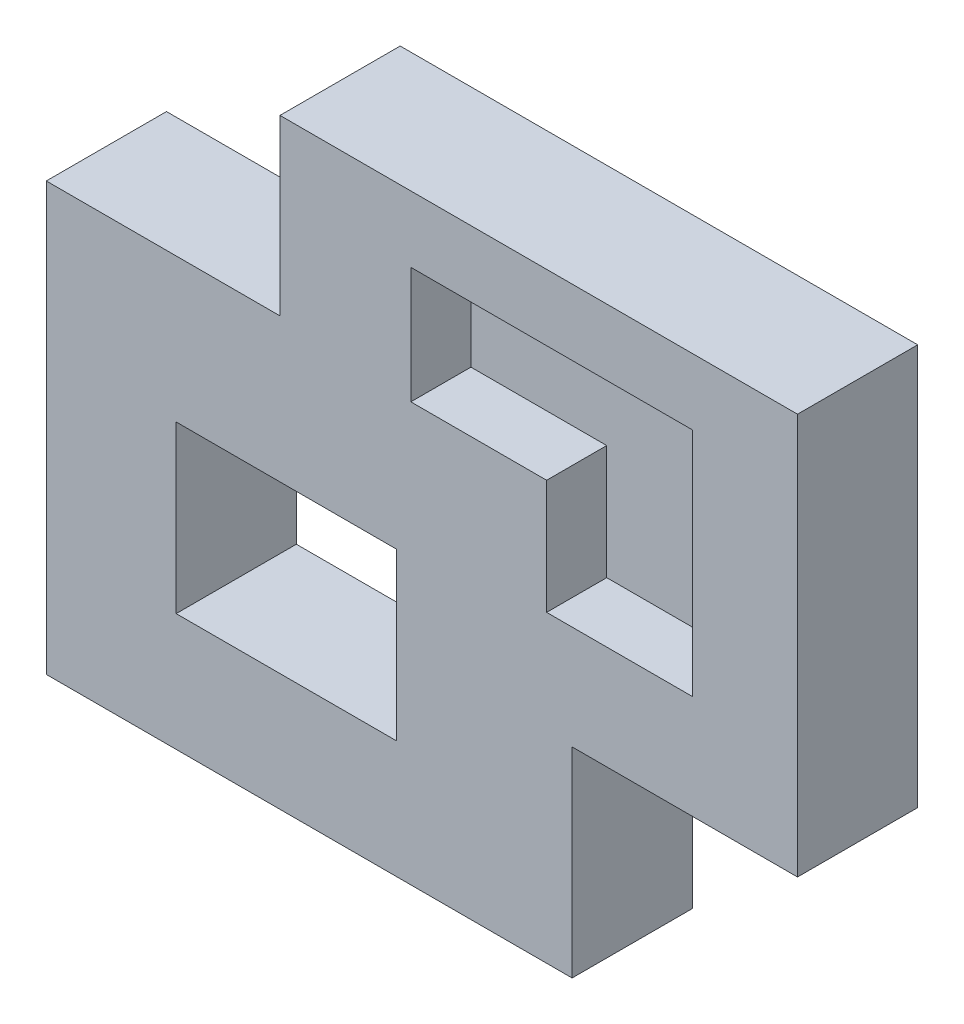
ISO-10303-21;
HEADER;
FILE_DESCRIPTION(('STEP AP214'),'2;1');
FILE_NAME('part.step','',(''),(''),'','','');
FILE_SCHEMA(('AUTOMOTIVE_DESIGN { 1 0 10303 214 1 1 1 1 }'));
ENDSEC;
DATA;
#1=APPLICATION_CONTEXT('core data for automotive mechanical design processes');
#2=APPLICATION_PROTOCOL_DEFINITION('international standard','automotive_design',2000,#1);
#3=PRODUCT_CONTEXT('',#1,'mechanical');
#4=PRODUCT('Part','Part','',(#3));
#5=PRODUCT_RELATED_PRODUCT_CATEGORY('part','',(#4));
#6=PRODUCT_DEFINITION_FORMATION('','',#4);
#7=PRODUCT_DEFINITION_CONTEXT('part definition',#1,'design');
#8=PRODUCT_DEFINITION('design','',#6,#7);
#9=PRODUCT_DEFINITION_SHAPE('','',#8);
#10=(LENGTH_UNIT() NAMED_UNIT(*) SI_UNIT(.MILLI.,.METRE.));
#11=(NAMED_UNIT(*) PLANE_ANGLE_UNIT() SI_UNIT($,.RADIAN.));
#12=(NAMED_UNIT(*) SI_UNIT($,.STERADIAN.) SOLID_ANGLE_UNIT());
#13=UNCERTAINTY_MEASURE_WITH_UNIT(LENGTH_MEASURE(1.E-05),#10,'distance_accuracy_value','');
#14=(GEOMETRIC_REPRESENTATION_CONTEXT(3) GLOBAL_UNCERTAINTY_ASSIGNED_CONTEXT((#13)) GLOBAL_UNIT_ASSIGNED_CONTEXT((#10,
#11,#12)) REPRESENTATION_CONTEXT('',''));
#15=CARTESIAN_POINT('',(0.,0.,0.));
#16=DIRECTION('',(0.,0.,1.));
#17=DIRECTION('',(1.,0.,0.));
#18=AXIS2_PLACEMENT_3D('',#15,#16,#17);
#19=CARTESIAN_POINT('',(0.,0.,20.));
#20=DIRECTION('',(1.,0.,0.));
#21=DIRECTION('',(0.,0.,-1.));
#22=AXIS2_PLACEMENT_3D('',#19,#20,#21);
#23=PLANE('',#22);
#24=DIRECTION('',(0.,-1.,0.));
#25=VECTOR('',#24,1.);
#26=CARTESIAN_POINT('',(0.,0.,0.));
#27=LINE('',#26,#25);
#28=CARTESIAN_POINT('',(0.,71.1101804123711,0.));
#29=VERTEX_POINT('',#28);
#30=CARTESIAN_POINT('',(0.,0.,0.));
#31=VERTEX_POINT('',#30);
#32=EDGE_CURVE('E249',#29,#31,#27,.T.);
#33=ORIENTED_EDGE('',*,*,#32,.T.);
#34=DIRECTION('',(0.,0.,-1.));
#35=VECTOR('',#34,1.);
#36=CARTESIAN_POINT('',(0.,0.,20.));
#37=LINE('',#36,#35);
#38=CARTESIAN_POINT('',(0.,0.,20.));
#39=VERTEX_POINT('',#38);
#40=EDGE_CURVE('E11',#39,#31,#37,.T.);
#41=ORIENTED_EDGE('',*,*,#40,.F.);
#42=DIRECTION('',(0.,-1.,0.));
#43=VECTOR('',#42,1.);
#44=CARTESIAN_POINT('',(0.,0.,20.));
#45=LINE('',#44,#43);
#46=CARTESIAN_POINT('',(0.,71.1101804123711,20.));
#47=VERTEX_POINT('',#46);
#48=EDGE_CURVE('E271',#47,#39,#45,.T.);
#49=ORIENTED_EDGE('',*,*,#48,.F.);
#50=DIRECTION('',(0.,0.,-1.));
#51=VECTOR('',#50,1.);
#52=CARTESIAN_POINT('',(0.,71.1101804123711,20.));
#53=LINE('',#52,#51);
#54=EDGE_CURVE('E288',#47,#29,#53,.T.);
#55=ORIENTED_EDGE('',*,*,#54,.T.);
#56=EDGE_LOOP('',(#33,#41,#49,#55));
#57=FACE_BOUND('',#56,.T.);
#58=ADVANCED_FACE('F42',(#57),#23,.F.);
#59=CARTESIAN_POINT('',(0.,0.,20.));
#60=DIRECTION('',(0.,1.,0.));
#61=DIRECTION('',(0.,0.,1.));
#62=AXIS2_PLACEMENT_3D('',#59,#60,#61);
#63=PLANE('',#62);
#64=DIRECTION('',(1.,0.,0.));
#65=VECTOR('',#64,1.);
#66=CARTESIAN_POINT('',(0.,0.,0.));
#67=LINE('',#66,#65);
#68=CARTESIAN_POINT('',(87.4925257731959,0.,0.));
#69=VERTEX_POINT('',#68);
#70=EDGE_CURVE('E257',#31,#69,#67,.T.);
#71=ORIENTED_EDGE('',*,*,#70,.T.);
#72=DIRECTION('',(0.,0.,-1.));
#73=VECTOR('',#72,1.);
#74=CARTESIAN_POINT('',(87.4925257731959,0.,20.));
#75=LINE('',#74,#73);
#76=CARTESIAN_POINT('',(87.4925257731959,0.,20.));
#77=VERTEX_POINT('',#76);
#78=EDGE_CURVE('E49',#77,#69,#75,.T.);
#79=ORIENTED_EDGE('',*,*,#78,.F.);
#80=DIRECTION('',(1.,0.,0.));
#81=VECTOR('',#80,1.);
#82=CARTESIAN_POINT('',(0.,0.,20.));
#83=LINE('',#82,#81);
#84=EDGE_CURVE('E274',#39,#77,#83,.T.);
#85=ORIENTED_EDGE('',*,*,#84,.F.);
#86=ORIENTED_EDGE('',*,*,#40,.T.);
#87=EDGE_LOOP('',(#71,#79,#85,#86));
#88=FACE_BOUND('',#87,.T.);
#89=ADVANCED_FACE('F332',(#88),#63,.F.);
#90=CARTESIAN_POINT('',(87.4925257731959,0.,20.));
#91=DIRECTION('',(-1.,0.,0.));
#92=DIRECTION('',(0.,0.,1.));
#93=AXIS2_PLACEMENT_3D('',#90,#91,#92);
#94=PLANE('',#93);
#95=DIRECTION('',(0.,1.,0.));
#96=VECTOR('',#95,1.);
#97=CARTESIAN_POINT('',(87.4925257731959,0.,0.));
#98=LINE('',#97,#96);
#99=CARTESIAN_POINT('',(87.4925257731959,33.3047680412371,0.));
#100=VERTEX_POINT('',#99);
#101=EDGE_CURVE('E259',#69,#100,#98,.T.);
#102=ORIENTED_EDGE('',*,*,#101,.T.);
#103=DIRECTION('',(0.,0.,-1.));
#104=VECTOR('',#103,1.);
#105=CARTESIAN_POINT('',(87.4925257731959,33.3047680412371,20.));
#106=LINE('',#105,#104);
#107=CARTESIAN_POINT('',(87.4925257731959,33.3047680412371,20.));
#108=VERTEX_POINT('',#107);
#109=EDGE_CURVE('E303',#108,#100,#106,.T.);
#110=ORIENTED_EDGE('',*,*,#109,.F.);
#111=DIRECTION('',(0.,1.,0.));
#112=VECTOR('',#111,1.);
#113=CARTESIAN_POINT('',(87.4925257731959,0.,20.));
#114=LINE('',#113,#112);
#115=EDGE_CURVE('E276',#77,#108,#114,.T.);
#116=ORIENTED_EDGE('',*,*,#115,.F.);
#117=ORIENTED_EDGE('',*,*,#78,.T.);
#118=EDGE_LOOP('',(#102,#110,#116,#117));
#119=FACE_BOUND('',#118,.T.);
#120=ADVANCED_FACE('F310',(#119),#94,.F.);
#121=CARTESIAN_POINT('',(125.,33.3047680412371,20.));
#122=DIRECTION('',(0.,1.,0.));
#123=DIRECTION('',(0.,0.,1.));
#124=AXIS2_PLACEMENT_3D('',#121,#122,#123);
#125=PLANE('',#124);
#126=DIRECTION('',(1.,0.,0.));
#127=VECTOR('',#126,1.);
#128=CARTESIAN_POINT('',(125.,33.3047680412371,0.));
#129=LINE('',#128,#127);
#130=CARTESIAN_POINT('',(125.,33.3047680412371,0.));
#131=VERTEX_POINT('',#130);
#132=EDGE_CURVE('E261',#100,#131,#129,.T.);
#133=ORIENTED_EDGE('',*,*,#132,.T.);
#134=DIRECTION('',(0.,0.,-1.));
#135=VECTOR('',#134,1.);
#136=CARTESIAN_POINT('',(125.,33.3047680412371,20.));
#137=LINE('',#136,#135);
#138=CARTESIAN_POINT('',(125.,33.3047680412371,20.));
#139=VERTEX_POINT('',#138);
#140=EDGE_CURVE('E300',#139,#131,#137,.T.);
#141=ORIENTED_EDGE('',*,*,#140,.F.);
#142=DIRECTION('',(1.,0.,0.));
#143=VECTOR('',#142,1.);
#144=CARTESIAN_POINT('',(125.,33.3047680412371,20.));
#145=LINE('',#144,#143);
#146=EDGE_CURVE('E278',#108,#139,#145,.T.);
#147=ORIENTED_EDGE('',*,*,#146,.F.);
#148=ORIENTED_EDGE('',*,*,#109,.T.);
#149=EDGE_LOOP('',(#133,#141,#147,#148));
#150=FACE_BOUND('',#149,.T.);
#151=ADVANCED_FACE('F321',(#150),#125,.F.);
#152=CARTESIAN_POINT('',(125.,33.3047680412371,20.));
#153=DIRECTION('',(-1.,0.,0.));
#154=DIRECTION('',(0.,0.,1.));
#155=AXIS2_PLACEMENT_3D('',#152,#153,#154);
#156=PLANE('',#155);
#157=DIRECTION('',(0.,1.,0.));
#158=VECTOR('',#157,1.);
#159=CARTESIAN_POINT('',(125.,33.3047680412371,0.));
#160=LINE('',#159,#158);
#161=CARTESIAN_POINT('',(125.,100.,0.));
#162=VERTEX_POINT('',#161);
#163=EDGE_CURVE('E263',#131,#162,#160,.T.);
#164=ORIENTED_EDGE('',*,*,#163,.T.);
#165=DIRECTION('',(0.,0.,-1.));
#166=VECTOR('',#165,1.);
#167=CARTESIAN_POINT('',(125.,100.,20.));
#168=LINE('',#167,#166);
#169=CARTESIAN_POINT('',(125.,100.,20.));
#170=VERTEX_POINT('',#169);
#171=EDGE_CURVE('E297',#170,#162,#168,.T.);
#172=ORIENTED_EDGE('',*,*,#171,.F.);
#173=DIRECTION('',(0.,1.,0.));
#174=VECTOR('',#173,1.);
#175=CARTESIAN_POINT('',(125.,33.3047680412371,20.));
#176=LINE('',#175,#174);
#177=EDGE_CURVE('E280',#139,#170,#176,.T.);
#178=ORIENTED_EDGE('',*,*,#177,.F.);
#179=ORIENTED_EDGE('',*,*,#140,.T.);
#180=EDGE_LOOP('',(#164,#172,#178,#179));
#181=FACE_BOUND('',#180,.T.);
#182=ADVANCED_FACE('F325',(#181),#156,.F.);
#183=CARTESIAN_POINT('',(38.8855670103093,100.,20.));
#184=DIRECTION('',(0.,-1.,0.));
#185=DIRECTION('',(0.,0.,-1.));
#186=AXIS2_PLACEMENT_3D('',#183,#184,#185);
#187=PLANE('',#186);
#188=DIRECTION('',(-1.,0.,0.));
#189=VECTOR('',#188,1.);
#190=CARTESIAN_POINT('',(38.8855670103093,100.,0.));
#191=LINE('',#190,#189);
#192=CARTESIAN_POINT('',(38.8855670103093,100.,0.));
#193=VERTEX_POINT('',#192);
#194=EDGE_CURVE('E265',#162,#193,#191,.T.);
#195=ORIENTED_EDGE('',*,*,#194,.T.);
#196=DIRECTION('',(0.,0.,-1.));
#197=VECTOR('',#196,1.);
#198=CARTESIAN_POINT('',(38.8855670103093,100.,20.));
#199=LINE('',#198,#197);
#200=CARTESIAN_POINT('',(38.8855670103093,100.,20.));
#201=VERTEX_POINT('',#200);
#202=EDGE_CURVE('E294',#201,#193,#199,.T.);
#203=ORIENTED_EDGE('',*,*,#202,.F.);
#204=DIRECTION('',(-1.,0.,0.));
#205=VECTOR('',#204,1.);
#206=CARTESIAN_POINT('',(38.8855670103093,100.,20.));
#207=LINE('',#206,#205);
#208=EDGE_CURVE('E282',#170,#201,#207,.T.);
#209=ORIENTED_EDGE('',*,*,#208,.F.);
#210=ORIENTED_EDGE('',*,*,#171,.T.);
#211=EDGE_LOOP('',(#195,#203,#209,#210));
#212=FACE_BOUND('',#211,.T.);
#213=ADVANCED_FACE('F345',(#212),#187,.F.);
#214=CARTESIAN_POINT('',(38.8855670103093,100.,20.));
#215=DIRECTION('',(1.,0.,0.));
#216=DIRECTION('',(0.,0.,-1.));
#217=AXIS2_PLACEMENT_3D('',#214,#215,#216);
#218=PLANE('',#217);
#219=DIRECTION('',(0.,-1.,0.));
#220=VECTOR('',#219,1.);
#221=CARTESIAN_POINT('',(38.8855670103093,100.,0.));
#222=LINE('',#221,#220);
#223=CARTESIAN_POINT('',(38.8855670103093,71.1101804123711,0.));
#224=VERTEX_POINT('',#223);
#225=EDGE_CURVE('E267',#193,#224,#222,.T.);
#226=ORIENTED_EDGE('',*,*,#225,.T.);
#227=DIRECTION('',(0.,0.,-1.));
#228=VECTOR('',#227,1.);
#229=CARTESIAN_POINT('',(38.8855670103093,71.1101804123711,20.));
#230=LINE('',#229,#228);
#231=CARTESIAN_POINT('',(38.8855670103093,71.1101804123711,20.));
#232=VERTEX_POINT('',#231);
#233=EDGE_CURVE('E291',#232,#224,#230,.T.);
#234=ORIENTED_EDGE('',*,*,#233,.F.);
#235=DIRECTION('',(0.,-1.,0.));
#236=VECTOR('',#235,1.);
#237=CARTESIAN_POINT('',(38.8855670103093,100.,20.));
#238=LINE('',#237,#236);
#239=EDGE_CURVE('E284',#201,#232,#238,.T.);
#240=ORIENTED_EDGE('',*,*,#239,.F.);
#241=ORIENTED_EDGE('',*,*,#202,.T.);
#242=EDGE_LOOP('',(#226,#234,#240,#241));
#243=FACE_BOUND('',#242,.T.);
#244=ADVANCED_FACE('F343',(#243),#218,.F.);
#245=CARTESIAN_POINT('',(0.,71.1101804123711,20.));
#246=DIRECTION('',(0.,-1.,0.));
#247=DIRECTION('',(0.,0.,-1.));
#248=AXIS2_PLACEMENT_3D('',#245,#246,#247);
#249=PLANE('',#248);
#250=DIRECTION('',(-1.,0.,0.));
#251=VECTOR('',#250,1.);
#252=CARTESIAN_POINT('',(0.,71.1101804123711,0.));
#253=LINE('',#252,#251);
#254=EDGE_CURVE('E269',#224,#29,#253,.T.);
#255=ORIENTED_EDGE('',*,*,#254,.T.);
#256=ORIENTED_EDGE('',*,*,#54,.F.);
#257=DIRECTION('',(-1.,0.,0.));
#258=VECTOR('',#257,1.);
#259=CARTESIAN_POINT('',(0.,71.1101804123711,20.));
#260=LINE('',#259,#258);
#261=EDGE_CURVE('E286',#232,#47,#260,.T.);
#262=ORIENTED_EDGE('',*,*,#261,.F.);
#263=ORIENTED_EDGE('',*,*,#233,.T.);
#264=EDGE_LOOP('',(#255,#256,#262,#263));
#265=FACE_BOUND('',#264,.T.);
#266=ADVANCED_FACE('F338',(#265),#249,.F.);
#267=CARTESIAN_POINT('',(0.,71.1101804123711,20.));
#268=DIRECTION('',(0.,0.,-1.));
#269=DIRECTION('',(-1.,0.,0.));
#270=AXIS2_PLACEMENT_3D('',#267,#268,#269);
#271=PLANE('',#270);
#272=DIRECTION('',(1.,0.,0.));
#273=VECTOR('',#272,1.);
#274=CARTESIAN_POINT('',(83.2532134965902,69.6086472129878,20.));
#275=LINE('',#274,#273);
#276=CARTESIAN_POINT('',(60.6589668851143,69.6086472129878,20.));
#277=VERTEX_POINT('',#276);
#278=CARTESIAN_POINT('',(83.2532134965902,69.6086472129878,20.));
#279=VERTEX_POINT('',#278);
#280=EDGE_CURVE('E181',#277,#279,#275,.T.);
#281=ORIENTED_EDGE('',*,*,#280,.F.);
#282=DIRECTION('',(0.,-1.,0.));
#283=VECTOR('',#282,1.);
#284=CARTESIAN_POINT('',(60.6589668851143,69.6086472129878,20.));
#285=LINE('',#284,#283);
#286=CARTESIAN_POINT('',(60.6589668851143,88.9952859072309,20.));
#287=VERTEX_POINT('',#286);
#288=EDGE_CURVE('E56',#287,#277,#285,.T.);
#289=ORIENTED_EDGE('',*,*,#288,.F.);
#290=DIRECTION('',(-1.,0.,0.));
#291=VECTOR('',#290,1.);
#292=CARTESIAN_POINT('',(60.6589668851143,88.9952859072309,20.));
#293=LINE('',#292,#291);
#294=CARTESIAN_POINT('',(107.488557573703,88.9952859072309,20.));
#295=VERTEX_POINT('',#294);
#296=EDGE_CURVE('E198',#295,#287,#293,.T.);
#297=ORIENTED_EDGE('',*,*,#296,.F.);
#298=DIRECTION('',(0.,1.,0.));
#299=VECTOR('',#298,1.);
#300=CARTESIAN_POINT('',(107.488557573703,88.9952859072309,20.));
#301=LINE('',#300,#299);
#302=CARTESIAN_POINT('',(107.488557573703,50.5688125000461,20.));
#303=VERTEX_POINT('',#302);
#304=EDGE_CURVE('E192',#303,#295,#301,.T.);
#305=ORIENTED_EDGE('',*,*,#304,.F.);
#306=DIRECTION('',(1.,0.,0.));
#307=VECTOR('',#306,1.);
#308=CARTESIAN_POINT('',(107.488557573703,50.5688125000461,20.));
#309=LINE('',#308,#307);
#310=CARTESIAN_POINT('',(83.2532134965902,50.5688125000461,20.));
#311=VERTEX_POINT('',#310);
#312=EDGE_CURVE('E190',#311,#303,#309,.T.);
#313=ORIENTED_EDGE('',*,*,#312,.F.);
#314=DIRECTION('',(0.,-1.,0.));
#315=VECTOR('',#314,1.);
#316=CARTESIAN_POINT('',(83.2532134965902,50.5688125000461,20.));
#317=LINE('',#316,#315);
#318=EDGE_CURVE('E170',#279,#311,#317,.T.);
#319=ORIENTED_EDGE('',*,*,#318,.F.);
#320=EDGE_LOOP('',(#281,#289,#297,#305,#313,#319));
#321=FACE_BOUND('',#320,.T.);
#322=DIRECTION('',(1.,0.,0.));
#323=VECTOR('',#322,1.);
#324=CARTESIAN_POINT('',(21.6092161605559,19.565839264942,20.));
#325=LINE('',#324,#323);
#326=CARTESIAN_POINT('',(21.6092161605559,19.565839264942,20.));
#327=VERTEX_POINT('',#326);
#328=CARTESIAN_POINT('',(58.2952906866012,19.565839264942,20.));
#329=VERTEX_POINT('',#328);
#330=EDGE_CURVE('E225',#327,#329,#325,.T.);
#331=ORIENTED_EDGE('',*,*,#330,.F.);
#332=DIRECTION('',(0.,-1.,0.));
#333=VECTOR('',#332,1.);
#334=CARTESIAN_POINT('',(21.6092161605559,47.1853025067048,20.));
#335=LINE('',#334,#333);
#336=CARTESIAN_POINT('',(21.6092161605559,47.1853025067048,20.));
#337=VERTEX_POINT('',#336);
#338=EDGE_CURVE('E64',#337,#327,#335,.T.);
#339=ORIENTED_EDGE('',*,*,#338,.F.);
#340=DIRECTION('',(-1.,0.,0.));
#341=VECTOR('',#340,1.);
#342=CARTESIAN_POINT('',(21.6092161605559,47.1853025067048,20.));
#343=LINE('',#342,#341);
#344=CARTESIAN_POINT('',(58.2952906866012,47.1853025067048,20.));
#345=VERTEX_POINT('',#344);
#346=EDGE_CURVE('E231',#345,#337,#343,.T.);
#347=ORIENTED_EDGE('',*,*,#346,.F.);
#348=DIRECTION('',(0.,1.,0.));
#349=VECTOR('',#348,1.);
#350=CARTESIAN_POINT('',(58.2952906866012,47.1853025067048,20.));
#351=LINE('',#350,#349);
#352=EDGE_CURVE('E228',#329,#345,#351,.T.);
#353=ORIENTED_EDGE('',*,*,#352,.F.);
#354=EDGE_LOOP('',(#331,#339,#347,#353));
#355=FACE_BOUND('',#354,.T.);
#356=ORIENTED_EDGE('',*,*,#48,.T.);
#357=ORIENTED_EDGE('',*,*,#84,.T.);
#358=ORIENTED_EDGE('',*,*,#115,.T.);
#359=ORIENTED_EDGE('',*,*,#146,.T.);
#360=ORIENTED_EDGE('',*,*,#177,.T.);
#361=ORIENTED_EDGE('',*,*,#208,.T.);
#362=ORIENTED_EDGE('',*,*,#239,.T.);
#363=ORIENTED_EDGE('',*,*,#261,.T.);
#364=EDGE_LOOP('',(#356,#357,#358,#359,#360,#361,#362,#363));
#365=FACE_BOUND('',#364,.T.);
#366=ADVANCED_FACE('F186',(#321,#355,#365),#271,.F.);
#367=CARTESIAN_POINT('',(0.,71.1101804123711,0.));
#368=DIRECTION('',(0.,0.,-1.));
#369=DIRECTION('',(-1.,0.,0.));
#370=AXIS2_PLACEMENT_3D('',#367,#368,#369);
#371=PLANE('',#370);
#372=DIRECTION('',(0.,-1.,0.));
#373=VECTOR('',#372,1.);
#374=CARTESIAN_POINT('',(21.6092161605559,47.1853025067048,0.));
#375=LINE('',#374,#373);
#376=CARTESIAN_POINT('',(21.6092161605559,47.1853025067048,0.));
#377=VERTEX_POINT('',#376);
#378=CARTESIAN_POINT('',(21.6092161605559,19.565839264942,0.));
#379=VERTEX_POINT('',#378);
#380=EDGE_CURVE('E234',#377,#379,#375,.T.);
#381=ORIENTED_EDGE('',*,*,#380,.T.);
#382=DIRECTION('',(1.,0.,0.));
#383=VECTOR('',#382,1.);
#384=CARTESIAN_POINT('',(21.6092161605559,19.565839264942,0.));
#385=LINE('',#384,#383);
#386=CARTESIAN_POINT('',(58.2952906866012,19.565839264942,0.));
#387=VERTEX_POINT('',#386);
#388=EDGE_CURVE('E237',#379,#387,#385,.T.);
#389=ORIENTED_EDGE('',*,*,#388,.T.);
#390=DIRECTION('',(0.,1.,0.));
#391=VECTOR('',#390,1.);
#392=CARTESIAN_POINT('',(58.2952906866012,47.1853025067048,0.));
#393=LINE('',#392,#391);
#394=CARTESIAN_POINT('',(58.2952906866012,47.1853025067048,0.));
#395=VERTEX_POINT('',#394);
#396=EDGE_CURVE('E240',#387,#395,#393,.T.);
#397=ORIENTED_EDGE('',*,*,#396,.T.);
#398=DIRECTION('',(-1.,0.,0.));
#399=VECTOR('',#398,1.);
#400=CARTESIAN_POINT('',(21.6092161605559,47.1853025067048,0.));
#401=LINE('',#400,#399);
#402=EDGE_CURVE('E243',#395,#377,#401,.T.);
#403=ORIENTED_EDGE('',*,*,#402,.T.);
#404=EDGE_LOOP('',(#381,#389,#397,#403));
#405=FACE_BOUND('',#404,.T.);
#406=ORIENTED_EDGE('',*,*,#32,.F.);
#407=ORIENTED_EDGE('',*,*,#254,.F.);
#408=ORIENTED_EDGE('',*,*,#225,.F.);
#409=ORIENTED_EDGE('',*,*,#194,.F.);
#410=ORIENTED_EDGE('',*,*,#163,.F.);
#411=ORIENTED_EDGE('',*,*,#132,.F.);
#412=ORIENTED_EDGE('',*,*,#101,.F.);
#413=ORIENTED_EDGE('',*,*,#70,.F.);
#414=EDGE_LOOP('',(#406,#407,#408,#409,#410,#411,#412,#413));
#415=FACE_BOUND('',#414,.T.);
#416=ADVANCED_FACE('F316',(#405,#415),#371,.T.);
#417=CARTESIAN_POINT('',(21.6092161605559,47.1853025067048,0.));
#418=DIRECTION('',(-1.,0.,0.));
#419=DIRECTION('',(0.,0.,1.));
#420=AXIS2_PLACEMENT_3D('',#417,#418,#419);
#421=PLANE('',#420);
#422=ORIENTED_EDGE('',*,*,#338,.T.);
#423=DIRECTION('',(0.,0.,1.));
#424=VECTOR('',#423,1.);
#425=CARTESIAN_POINT('',(21.6092161605559,19.565839264942,0.));
#426=LINE('',#425,#424);
#427=EDGE_CURVE('E246',#379,#327,#426,.T.);
#428=ORIENTED_EDGE('',*,*,#427,.F.);
#429=ORIENTED_EDGE('',*,*,#380,.F.);
#430=DIRECTION('',(0.,0.,1.));
#431=VECTOR('',#430,1.);
#432=CARTESIAN_POINT('',(21.6092161605559,47.1853025067048,0.));
#433=LINE('',#432,#431);
#434=EDGE_CURVE('E247',#377,#337,#433,.T.);
#435=ORIENTED_EDGE('',*,*,#434,.T.);
#436=EDGE_LOOP('',(#422,#428,#429,#435));
#437=FACE_BOUND('',#436,.T.);
#438=ADVANCED_FACE('F408',(#437),#421,.F.);
#439=CARTESIAN_POINT('',(21.6092161605559,47.1853025067048,0.));
#440=DIRECTION('',(0.,1.,0.));
#441=DIRECTION('',(0.,0.,1.));
#442=AXIS2_PLACEMENT_3D('',#439,#440,#441);
#443=PLANE('',#442);
#444=ORIENTED_EDGE('',*,*,#346,.T.);
#445=ORIENTED_EDGE('',*,*,#434,.F.);
#446=ORIENTED_EDGE('',*,*,#402,.F.);
#447=DIRECTION('',(0.,0.,1.));
#448=VECTOR('',#447,1.);
#449=CARTESIAN_POINT('',(58.2952906866012,47.1853025067048,0.));
#450=LINE('',#449,#448);
#451=EDGE_CURVE('E250',#395,#345,#450,.T.);
#452=ORIENTED_EDGE('',*,*,#451,.T.);
#453=EDGE_LOOP('',(#444,#445,#446,#452));
#454=FACE_BOUND('',#453,.T.);
#455=ADVANCED_FACE('F417',(#454),#443,.F.);
#456=CARTESIAN_POINT('',(58.2952906866012,47.1853025067048,0.));
#457=DIRECTION('',(1.,0.,0.));
#458=DIRECTION('',(0.,0.,-1.));
#459=AXIS2_PLACEMENT_3D('',#456,#457,#458);
#460=PLANE('',#459);
#461=ORIENTED_EDGE('',*,*,#352,.T.);
#462=ORIENTED_EDGE('',*,*,#451,.F.);
#463=ORIENTED_EDGE('',*,*,#396,.F.);
#464=DIRECTION('',(0.,0.,1.));
#465=VECTOR('',#464,1.);
#466=CARTESIAN_POINT('',(58.2952906866012,19.565839264942,0.));
#467=LINE('',#466,#465);
#468=EDGE_CURVE('E252',#387,#329,#467,.T.);
#469=ORIENTED_EDGE('',*,*,#468,.T.);
#470=EDGE_LOOP('',(#461,#462,#463,#469));
#471=FACE_BOUND('',#470,.T.);
#472=ADVANCED_FACE('F426',(#471),#460,.F.);
#473=CARTESIAN_POINT('',(21.6092161605559,19.565839264942,0.));
#474=DIRECTION('',(0.,-1.,0.));
#475=DIRECTION('',(0.,0.,-1.));
#476=AXIS2_PLACEMENT_3D('',#473,#474,#475);
#477=PLANE('',#476);
#478=ORIENTED_EDGE('',*,*,#330,.T.);
#479=ORIENTED_EDGE('',*,*,#468,.F.);
#480=ORIENTED_EDGE('',*,*,#388,.F.);
#481=ORIENTED_EDGE('',*,*,#427,.T.);
#482=EDGE_LOOP('',(#478,#479,#480,#481));
#483=FACE_BOUND('',#482,.T.);
#484=ADVANCED_FACE('F436',(#483),#477,.F.);
#485=CARTESIAN_POINT('',(60.6589668851143,69.6086472129878,10.));
#486=DIRECTION('',(-1.,0.,0.));
#487=DIRECTION('',(0.,0.,1.));
#488=AXIS2_PLACEMENT_3D('',#485,#486,#487);
#489=PLANE('',#488);
#490=ORIENTED_EDGE('',*,*,#288,.T.);
#491=DIRECTION('',(0.,0.,1.));
#492=VECTOR('',#491,1.);
#493=CARTESIAN_POINT('',(60.6589668851143,69.6086472129878,10.));
#494=LINE('',#493,#492);
#495=CARTESIAN_POINT('',(60.6589668851143,69.6086472129878,10.));
#496=VERTEX_POINT('',#495);
#497=EDGE_CURVE('E178',#496,#277,#494,.T.);
#498=ORIENTED_EDGE('',*,*,#497,.F.);
#499=DIRECTION('',(0.,-1.,0.));
#500=VECTOR('',#499,1.);
#501=CARTESIAN_POINT('',(60.6589668851143,69.6086472129878,10.));
#502=LINE('',#501,#500);
#503=CARTESIAN_POINT('',(60.6589668851143,88.9952859072309,10.));
#504=VERTEX_POINT('',#503);
#505=EDGE_CURVE('E201',#504,#496,#502,.T.);
#506=ORIENTED_EDGE('',*,*,#505,.F.);
#507=DIRECTION('',(0.,0.,1.));
#508=VECTOR('',#507,1.);
#509=CARTESIAN_POINT('',(60.6589668851143,88.9952859072309,10.));
#510=LINE('',#509,#508);
#511=EDGE_CURVE('E216',#504,#287,#510,.T.);
#512=ORIENTED_EDGE('',*,*,#511,.T.);
#513=EDGE_LOOP('',(#490,#498,#506,#512));
#514=FACE_BOUND('',#513,.T.);
#515=ADVANCED_FACE('F446',(#514),#489,.F.);
#516=CARTESIAN_POINT('',(60.6589668851143,88.9952859072309,10.));
#517=DIRECTION('',(0.,1.,0.));
#518=DIRECTION('',(0.,0.,1.));
#519=AXIS2_PLACEMENT_3D('',#516,#517,#518);
#520=PLANE('',#519);
#521=ORIENTED_EDGE('',*,*,#296,.T.);
#522=ORIENTED_EDGE('',*,*,#511,.F.);
#523=DIRECTION('',(-1.,0.,0.));
#524=VECTOR('',#523,1.);
#525=CARTESIAN_POINT('',(60.6589668851143,88.9952859072309,10.));
#526=LINE('',#525,#524);
#527=CARTESIAN_POINT('',(107.488557573703,88.9952859072309,10.));
#528=VERTEX_POINT('',#527);
#529=EDGE_CURVE('E213',#528,#504,#526,.T.);
#530=ORIENTED_EDGE('',*,*,#529,.F.);
#531=DIRECTION('',(0.,0.,1.));
#532=VECTOR('',#531,1.);
#533=CARTESIAN_POINT('',(107.488557573703,88.9952859072309,10.));
#534=LINE('',#533,#532);
#535=EDGE_CURVE('E218',#528,#295,#534,.T.);
#536=ORIENTED_EDGE('',*,*,#535,.T.);
#537=EDGE_LOOP('',(#521,#522,#530,#536));
#538=FACE_BOUND('',#537,.T.);
#539=ADVANCED_FACE('F456',(#538),#520,.F.);
#540=CARTESIAN_POINT('',(107.488557573703,88.9952859072309,10.));
#541=DIRECTION('',(1.,0.,0.));
#542=DIRECTION('',(0.,0.,-1.));
#543=AXIS2_PLACEMENT_3D('',#540,#541,#542);
#544=PLANE('',#543);
#545=ORIENTED_EDGE('',*,*,#304,.T.);
#546=ORIENTED_EDGE('',*,*,#535,.F.);
#547=DIRECTION('',(0.,1.,0.));
#548=VECTOR('',#547,1.);
#549=CARTESIAN_POINT('',(107.488557573703,88.9952859072309,10.));
#550=LINE('',#549,#548);
#551=CARTESIAN_POINT('',(107.488557573703,50.5688125000461,10.));
#552=VERTEX_POINT('',#551);
#553=EDGE_CURVE('E210',#552,#528,#550,.T.);
#554=ORIENTED_EDGE('',*,*,#553,.F.);
#555=DIRECTION('',(0.,0.,1.));
#556=VECTOR('',#555,1.);
#557=CARTESIAN_POINT('',(107.488557573703,50.5688125000461,10.));
#558=LINE('',#557,#556);
#559=EDGE_CURVE('E220',#552,#303,#558,.T.);
#560=ORIENTED_EDGE('',*,*,#559,.T.);
#561=EDGE_LOOP('',(#545,#546,#554,#560));
#562=FACE_BOUND('',#561,.T.);
#563=ADVANCED_FACE('F465',(#562),#544,.F.);
#564=CARTESIAN_POINT('',(107.488557573703,50.5688125000461,10.));
#565=DIRECTION('',(0.,-1.,0.));
#566=DIRECTION('',(0.,0.,-1.));
#567=AXIS2_PLACEMENT_3D('',#564,#565,#566);
#568=PLANE('',#567);
#569=ORIENTED_EDGE('',*,*,#312,.T.);
#570=ORIENTED_EDGE('',*,*,#559,.F.);
#571=DIRECTION('',(1.,0.,0.));
#572=VECTOR('',#571,1.);
#573=CARTESIAN_POINT('',(107.488557573703,50.5688125000461,10.));
#574=LINE('',#573,#572);
#575=CARTESIAN_POINT('',(83.2532134965902,50.5688125000461,10.));
#576=VERTEX_POINT('',#575);
#577=EDGE_CURVE('E207',#576,#552,#574,.T.);
#578=ORIENTED_EDGE('',*,*,#577,.F.);
#579=DIRECTION('',(0.,0.,1.));
#580=VECTOR('',#579,1.);
#581=CARTESIAN_POINT('',(83.2532134965902,50.5688125000461,10.));
#582=LINE('',#581,#580);
#583=EDGE_CURVE('E177',#576,#311,#582,.T.);
#584=ORIENTED_EDGE('',*,*,#583,.T.);
#585=EDGE_LOOP('',(#569,#570,#578,#584));
#586=FACE_BOUND('',#585,.T.);
#587=ADVANCED_FACE('F475',(#586),#568,.F.);
#588=CARTESIAN_POINT('',(83.2532134965902,50.5688125000461,10.));
#589=DIRECTION('',(-1.,0.,0.));
#590=DIRECTION('',(0.,0.,1.));
#591=AXIS2_PLACEMENT_3D('',#588,#589,#590);
#592=PLANE('',#591);
#593=ORIENTED_EDGE('',*,*,#318,.T.);
#594=ORIENTED_EDGE('',*,*,#583,.F.);
#595=DIRECTION('',(0.,-1.,0.));
#596=VECTOR('',#595,1.);
#597=CARTESIAN_POINT('',(83.2532134965902,50.5688125000461,10.));
#598=LINE('',#597,#596);
#599=CARTESIAN_POINT('',(83.2532134965902,69.6086472129878,10.));
#600=VERTEX_POINT('',#599);
#601=EDGE_CURVE('E173',#600,#576,#598,.T.);
#602=ORIENTED_EDGE('',*,*,#601,.F.);
#603=DIRECTION('',(0.,0.,1.));
#604=VECTOR('',#603,1.);
#605=CARTESIAN_POINT('',(83.2532134965902,69.6086472129878,10.));
#606=LINE('',#605,#604);
#607=EDGE_CURVE('E166',#600,#279,#606,.T.);
#608=ORIENTED_EDGE('',*,*,#607,.T.);
#609=EDGE_LOOP('',(#593,#594,#602,#608));
#610=FACE_BOUND('',#609,.T.);
#611=ADVANCED_FACE('F168',(#610),#592,.F.);
#612=CARTESIAN_POINT('',(83.2532134965902,69.6086472129878,10.));
#613=DIRECTION('',(0.,-1.,0.));
#614=DIRECTION('',(0.,0.,-1.));
#615=AXIS2_PLACEMENT_3D('',#612,#613,#614);
#616=PLANE('',#615);
#617=ORIENTED_EDGE('',*,*,#280,.T.);
#618=ORIENTED_EDGE('',*,*,#607,.F.);
#619=DIRECTION('',(1.,0.,0.));
#620=VECTOR('',#619,1.);
#621=CARTESIAN_POINT('',(83.2532134965902,69.6086472129878,10.));
#622=LINE('',#621,#620);
#623=EDGE_CURVE('E204',#496,#600,#622,.T.);
#624=ORIENTED_EDGE('',*,*,#623,.F.);
#625=ORIENTED_EDGE('',*,*,#497,.T.);
#626=EDGE_LOOP('',(#617,#618,#624,#625));
#627=FACE_BOUND('',#626,.T.);
#628=ADVANCED_FACE('F182',(#627),#616,.F.);
#629=CARTESIAN_POINT('',(60.6589668851143,88.9952859072309,10.));
#630=DIRECTION('',(0.,0.,-1.));
#631=DIRECTION('',(-1.,0.,0.));
#632=AXIS2_PLACEMENT_3D('',#629,#630,#631);
#633=PLANE('',#632);
#634=ORIENTED_EDGE('',*,*,#505,.T.);
#635=ORIENTED_EDGE('',*,*,#623,.T.);
#636=ORIENTED_EDGE('',*,*,#601,.T.);
#637=ORIENTED_EDGE('',*,*,#577,.T.);
#638=ORIENTED_EDGE('',*,*,#553,.T.);
#639=ORIENTED_EDGE('',*,*,#529,.T.);
#640=EDGE_LOOP('',(#634,#635,#636,#637,#638,#639));
#641=FACE_BOUND('',#640,.T.);
#642=ADVANCED_FACE('F502',(#641),#633,.F.);
#643=CLOSED_SHELL('',(#58,#89,#120,#151,#182,#213,#244,#266,#366,#416,#438,#455,#472,#484,#515,
#539,#563,#587,#611,#628,#642));
#644=MANIFOLD_SOLID_BREP('B2',#643);
#645=ADVANCED_BREP_SHAPE_REPRESENTATION('',(#18,#644),#14);
#646=SHAPE_DEFINITION_REPRESENTATION(#9,#645);
ENDSEC;
END-ISO-10303-21;
